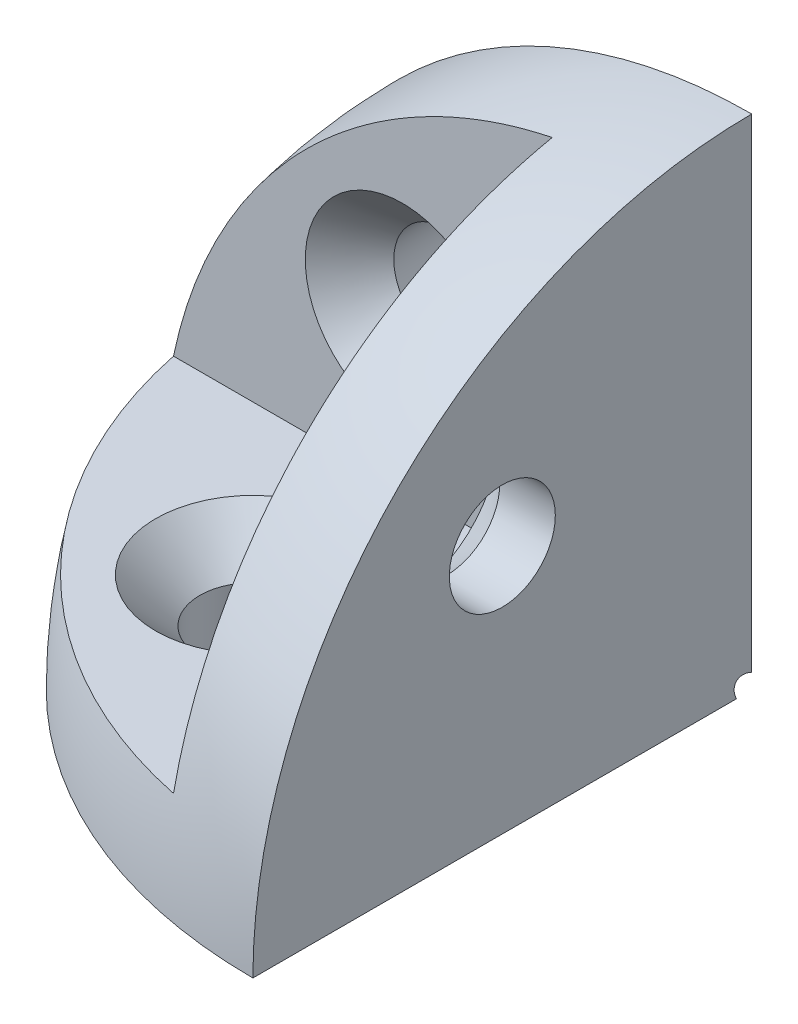
ISO-10303-21;
HEADER;
FILE_DESCRIPTION(('STEP AP214'),'2;1');
FILE_NAME('part.step','',(''),(''),'','','');
FILE_SCHEMA(('AUTOMOTIVE_DESIGN { 1 0 10303 214 1 1 1 1 }'));
ENDSEC;
DATA;
#1=APPLICATION_CONTEXT('core data for automotive mechanical design processes');
#2=APPLICATION_PROTOCOL_DEFINITION('international standard','automotive_design',2000,#1);
#3=PRODUCT_CONTEXT('',#1,'mechanical');
#4=PRODUCT('Part','Part','',(#3));
#5=PRODUCT_RELATED_PRODUCT_CATEGORY('part','',(#4));
#6=PRODUCT_DEFINITION_FORMATION('','',#4);
#7=PRODUCT_DEFINITION_CONTEXT('part definition',#1,'design');
#8=PRODUCT_DEFINITION('design','',#6,#7);
#9=PRODUCT_DEFINITION_SHAPE('','',#8);
#10=(LENGTH_UNIT() NAMED_UNIT(*) SI_UNIT(.MILLI.,.METRE.));
#11=(NAMED_UNIT(*) PLANE_ANGLE_UNIT() SI_UNIT($,.RADIAN.));
#12=(NAMED_UNIT(*) SI_UNIT($,.STERADIAN.) SOLID_ANGLE_UNIT());
#13=UNCERTAINTY_MEASURE_WITH_UNIT(LENGTH_MEASURE(1.E-05),#10,'distance_accuracy_value','');
#14=(GEOMETRIC_REPRESENTATION_CONTEXT(3) GLOBAL_UNCERTAINTY_ASSIGNED_CONTEXT((#13)) GLOBAL_UNIT_ASSIGNED_CONTEXT((#10,
#11,#12)) REPRESENTATION_CONTEXT('',''));
#15=CARTESIAN_POINT('',(0.,0.,0.));
#16=DIRECTION('',(0.,0.,1.));
#17=DIRECTION('',(1.,0.,0.));
#18=AXIS2_PLACEMENT_3D('',#15,#16,#17);
#19=CARTESIAN_POINT('',(0.,0.,0.));
#20=DIRECTION('',(0.,1.,0.));
#21=DIRECTION('',(0.,0.,1.));
#22=AXIS2_PLACEMENT_3D('',#19,#20,#21);
#23=PLANE('',#22);
#24=CARTESIAN_POINT('',(-19.9999999999999,0.,20.));
#25=DIRECTION('',(0.,-1.,0.));
#26=DIRECTION('',(0.,0.,-1.));
#27=AXIS2_PLACEMENT_3D('',#24,#25,#26);
#28=CIRCLE('',#27,4.25);
#29=CARTESIAN_POINT('',(-19.9999999999999,0.,15.75));
#30=VERTEX_POINT('',#29);
#31=EDGE_CURVE('E165',#30,#30,#28,.T.);
#32=ORIENTED_EDGE('',*,*,#31,.F.);
#33=EDGE_LOOP('',(#32));
#34=FACE_BOUND('',#33,.T.);
#35=DIRECTION('',(1.,0.,0.));
#36=VECTOR('',#35,1.);
#37=CARTESIAN_POINT('',(0.,0.,0.));
#38=LINE('',#37,#36);
#39=CARTESIAN_POINT('',(-40.,0.,0.));
#40=VERTEX_POINT('',#39);
#41=CARTESIAN_POINT('',(-1.22474487139158,0.,0.));
#42=VERTEX_POINT('',#41);
#43=EDGE_CURVE('E117',#40,#42,#38,.T.);
#44=ORIENTED_EDGE('',*,*,#43,.T.);
#45=CARTESIAN_POINT('',(0.,0.,0.));
#46=DIRECTION('',(0.,1.,0.));
#47=DIRECTION('',(0.707106781186546,0.,-0.707106781186549));
#48=AXIS2_PLACEMENT_3D('',#45,#46,#47);
#49=ELLIPSE('',#48,1.73205080756887,0.999999999999998);
#50=CARTESIAN_POINT('',(0.,0.,1.22474487139159));
#51=VERTEX_POINT('',#50);
#52=EDGE_CURVE('E48',#42,#51,#49,.T.);
#53=ORIENTED_EDGE('',*,*,#52,.T.);
#54=DIRECTION('',(0.,0.,-1.));
#55=VECTOR('',#54,1.);
#56=CARTESIAN_POINT('',(0.,0.,0.));
#57=LINE('',#56,#55);
#58=CARTESIAN_POINT('',(1.39659253553725E-13,0.,40.));
#59=VERTEX_POINT('',#58);
#60=EDGE_CURVE('E125',#59,#51,#57,.T.);
#61=ORIENTED_EDGE('',*,*,#60,.F.);
#62=CARTESIAN_POINT('',(0.,0.,0.));
#63=DIRECTION('',(0.,-1.,0.));
#64=DIRECTION('',(0.,0.,-1.));
#65=AXIS2_PLACEMENT_3D('',#62,#63,#64);
#66=CIRCLE('',#65,40.);
#67=EDGE_CURVE('E133',#59,#40,#66,.T.);
#68=ORIENTED_EDGE('',*,*,#67,.T.);
#69=EDGE_LOOP('',(#44,#53,#61,#68));
#70=FACE_BOUND('',#69,.T.);
#71=ADVANCED_FACE('F33',(#34,#70),#23,.F.);
#72=CARTESIAN_POINT('',(0.,0.,0.));
#73=DIRECTION('',(0.,-1.,0.));
#74=DIRECTION('',(0.,0.,1.));
#75=AXIS2_PLACEMENT_3D('',#72,#73,#74);
#76=SPHERICAL_SURFACE('',#75,40.);
#77=CARTESIAN_POINT('',(0.,0.,8.));
#78=DIRECTION('',(0.,0.,1.));
#79=DIRECTION('',(1.,0.,0.));
#80=AXIS2_PLACEMENT_3D('',#77,#78,#79);
#81=CIRCLE('',#80,39.1918358845309);
#82=CARTESIAN_POINT('',(-7.99999999999997,38.3666521865018,8.));
#83=VERTEX_POINT('',#82);
#84=CARTESIAN_POINT('',(-38.3666521865018,8.,8.));
#85=VERTEX_POINT('',#84);
#86=EDGE_CURVE('E102',#83,#85,#81,.T.);
#87=ORIENTED_EDGE('',*,*,#86,.F.);
#88=CARTESIAN_POINT('',(-8.,0.,0.));
#89=DIRECTION('',(1.,0.,0.));
#90=DIRECTION('',(0.,0.,-1.));
#91=AXIS2_PLACEMENT_3D('',#88,#89,#90);
#92=CIRCLE('',#91,39.1918358845309);
#93=CARTESIAN_POINT('',(-7.99999999999987,8.,38.3666521865018));
#94=VERTEX_POINT('',#93);
#95=EDGE_CURVE('E114',#83,#94,#92,.T.);
#96=ORIENTED_EDGE('',*,*,#95,.T.);
#97=CARTESIAN_POINT('',(0.,8.,0.));
#98=DIRECTION('',(0.,1.,0.));
#99=DIRECTION('',(0.,0.,1.));
#100=AXIS2_PLACEMENT_3D('',#97,#98,#99);
#101=CIRCLE('',#100,39.1918358845309);
#102=EDGE_CURVE('E115',#94,#85,#101,.F.);
#103=ORIENTED_EDGE('',*,*,#102,.T.);
#104=EDGE_LOOP('',(#87,#96,#103));
#105=FACE_BOUND('',#104,.T.);
#106=CARTESIAN_POINT('',(0.,0.,0.));
#107=DIRECTION('',(1.,0.,0.));
#108=DIRECTION('',(0.,0.,-1.));
#109=AXIS2_PLACEMENT_3D('',#106,#107,#108);
#110=CIRCLE('',#109,40.);
#111=CARTESIAN_POINT('',(0.,40.,0.));
#112=VERTEX_POINT('',#111);
#113=EDGE_CURVE('E130',#112,#59,#110,.T.);
#114=ORIENTED_EDGE('',*,*,#113,.F.);
#115=CARTESIAN_POINT('',(0.,0.,0.));
#116=DIRECTION('',(0.,0.,1.));
#117=DIRECTION('',(1.,0.,0.));
#118=AXIS2_PLACEMENT_3D('',#115,#116,#117);
#119=CIRCLE('',#118,40.);
#120=EDGE_CURVE('E122',#112,#40,#119,.T.);
#121=ORIENTED_EDGE('',*,*,#120,.T.);
#122=ORIENTED_EDGE('',*,*,#67,.F.);
#123=EDGE_LOOP('',(#114,#121,#122));
#124=FACE_BOUND('',#123,.T.);
#125=ADVANCED_FACE('F178',(#105,#124),#76,.T.);
#126=CARTESIAN_POINT('',(0.,0.,0.));
#127=DIRECTION('',(1.,0.,0.));
#128=DIRECTION('',(0.,0.,-1.));
#129=AXIS2_PLACEMENT_3D('',#126,#127,#128);
#130=PLANE('',#129);
#131=CARTESIAN_POINT('',(0.,0.,0.));
#132=DIRECTION('',(1.,0.,0.));
#133=DIRECTION('',(0.,-0.707106781186549,-0.707106781186546));
#134=AXIS2_PLACEMENT_3D('',#131,#132,#133);
#135=ELLIPSE('',#134,1.73205080756887,0.999999999999998);
#136=CARTESIAN_POINT('',(0.,1.22474487139159,0.));
#137=VERTEX_POINT('',#136);
#138=EDGE_CURVE('E169',#137,#51,#135,.T.);
#139=ORIENTED_EDGE('',*,*,#138,.F.);
#140=DIRECTION('',(0.,1.,0.));
#141=VECTOR('',#140,1.);
#142=CARTESIAN_POINT('',(0.,0.,0.));
#143=LINE('',#142,#141);
#144=EDGE_CURVE('E128',#137,#112,#143,.T.);
#145=ORIENTED_EDGE('',*,*,#144,.T.);
#146=ORIENTED_EDGE('',*,*,#113,.T.);
#147=ORIENTED_EDGE('',*,*,#60,.T.);
#148=EDGE_LOOP('',(#139,#145,#146,#147));
#149=FACE_BOUND('',#148,.T.);
#150=CARTESIAN_POINT('',(0.,20.,20.));
#151=DIRECTION('',(1.,0.,0.));
#152=DIRECTION('',(0.,0.,-1.));
#153=AXIS2_PLACEMENT_3D('',#150,#151,#152);
#154=CIRCLE('',#153,4.25);
#155=CARTESIAN_POINT('',(0.,20.,15.75));
#156=VERTEX_POINT('',#155);
#157=EDGE_CURVE('E103',#156,#156,#154,.T.);
#158=ORIENTED_EDGE('',*,*,#157,.F.);
#159=EDGE_LOOP('',(#158));
#160=FACE_BOUND('',#159,.T.);
#161=ADVANCED_FACE('F181',(#149,#160),#130,.T.);
#162=CARTESIAN_POINT('',(0.,0.,0.));
#163=DIRECTION('',(0.,0.,1.));
#164=DIRECTION('',(1.,0.,0.));
#165=AXIS2_PLACEMENT_3D('',#162,#163,#164);
#166=PLANE('',#165);
#167=CARTESIAN_POINT('',(-20.,20.,0.));
#168=DIRECTION('',(0.,0.,-1.));
#169=DIRECTION('',(-1.,0.,0.));
#170=AXIS2_PLACEMENT_3D('',#167,#168,#169);
#171=CIRCLE('',#170,4.25);
#172=CARTESIAN_POINT('',(-24.25,20.,0.));
#173=VERTEX_POINT('',#172);
#174=EDGE_CURVE('E107',#173,#173,#171,.T.);
#175=ORIENTED_EDGE('',*,*,#174,.F.);
#176=EDGE_LOOP('',(#175));
#177=FACE_BOUND('',#176,.T.);
#178=ORIENTED_EDGE('',*,*,#144,.F.);
#179=CARTESIAN_POINT('',(0.,0.,0.));
#180=DIRECTION('',(0.,0.,1.));
#181=DIRECTION('',(0.707106781186546,-0.707106781186549,0.));
#182=AXIS2_PLACEMENT_3D('',#179,#180,#181);
#183=ELLIPSE('',#182,1.73205080756887,0.999999999999998);
#184=EDGE_CURVE('E97',#137,#42,#183,.T.);
#185=ORIENTED_EDGE('',*,*,#184,.T.);
#186=ORIENTED_EDGE('',*,*,#43,.F.);
#187=ORIENTED_EDGE('',*,*,#120,.F.);
#188=EDGE_LOOP('',(#178,#185,#186,#187));
#189=FACE_BOUND('',#188,.T.);
#190=ADVANCED_FACE('F183',(#177,#189),#166,.F.);
#191=CARTESIAN_POINT('',(0.,8.,0.));
#192=DIRECTION('',(0.,1.,0.));
#193=DIRECTION('',(0.,0.,1.));
#194=AXIS2_PLACEMENT_3D('',#191,#192,#193);
#195=PLANE('',#194);
#196=CARTESIAN_POINT('',(-7.99999999999997,8.,8.));
#197=DIRECTION('',(0.,1.,0.));
#198=DIRECTION('',(0.707106781186546,0.,-0.707106781186549));
#199=AXIS2_PLACEMENT_3D('',#196,#197,#198);
#200=ELLIPSE('',#199,1.73205080756887,0.999999999999998);
#201=CARTESIAN_POINT('',(-9.22474487139156,8.,8.));
#202=VERTEX_POINT('',#201);
#203=CARTESIAN_POINT('',(-7.99999999999997,8.,9.22474487139159));
#204=VERTEX_POINT('',#203);
#205=EDGE_CURVE('E84',#202,#204,#200,.T.);
#206=ORIENTED_EDGE('',*,*,#205,.F.);
#207=DIRECTION('',(1.,0.,0.));
#208=VECTOR('',#207,1.);
#209=CARTESIAN_POINT('',(0.,8.,8.));
#210=LINE('',#209,#208);
#211=EDGE_CURVE('E93',#85,#202,#210,.T.);
#212=ORIENTED_EDGE('',*,*,#211,.F.);
#213=ORIENTED_EDGE('',*,*,#102,.F.);
#214=DIRECTION('',(0.,0.,-1.));
#215=VECTOR('',#214,1.);
#216=CARTESIAN_POINT('',(-8.,8.,0.));
#217=LINE('',#216,#215);
#218=EDGE_CURVE('E96',#94,#204,#217,.T.);
#219=ORIENTED_EDGE('',*,*,#218,.T.);
#220=EDGE_LOOP('',(#206,#212,#213,#219));
#221=FACE_BOUND('',#220,.T.);
#222=CARTESIAN_POINT('',(-19.9999999999999,8.,20.));
#223=DIRECTION('',(0.,1.,0.));
#224=DIRECTION('',(0.,0.,1.));
#225=AXIS2_PLACEMENT_3D('',#222,#223,#224);
#226=CIRCLE('',#225,7.80000000000001);
#227=CARTESIAN_POINT('',(-19.9999999999999,8.,27.8));
#228=VERTEX_POINT('',#227);
#229=EDGE_CURVE('E41',#228,#228,#226,.F.);
#230=ORIENTED_EDGE('',*,*,#229,.T.);
#231=EDGE_LOOP('',(#230));
#232=FACE_BOUND('',#231,.T.);
#233=ADVANCED_FACE('F91',(#221,#232),#195,.T.);
#234=CARTESIAN_POINT('',(-8.,0.,0.));
#235=DIRECTION('',(1.,0.,0.));
#236=DIRECTION('',(0.,0.,-1.));
#237=AXIS2_PLACEMENT_3D('',#234,#235,#236);
#238=PLANE('',#237);
#239=CARTESIAN_POINT('',(-7.99999999999993,20.,20.));
#240=DIRECTION('',(1.,0.,0.));
#241=DIRECTION('',(0.,0.,-1.));
#242=AXIS2_PLACEMENT_3D('',#239,#240,#241);
#243=CIRCLE('',#242,7.79999999999996);
#244=CARTESIAN_POINT('',(-7.99999999999996,20.,12.2000000000001));
#245=VERTEX_POINT('',#244);
#246=EDGE_CURVE('E135',#245,#245,#243,.T.);
#247=ORIENTED_EDGE('',*,*,#246,.T.);
#248=EDGE_LOOP('',(#247));
#249=FACE_BOUND('',#248,.T.);
#250=DIRECTION('',(0.,1.,0.));
#251=VECTOR('',#250,1.);
#252=CARTESIAN_POINT('',(-7.99999999999997,0.,8.));
#253=LINE('',#252,#251);
#254=CARTESIAN_POINT('',(-7.99999999999997,9.22474487139159,8.));
#255=VERTEX_POINT('',#254);
#256=EDGE_CURVE('E112',#255,#83,#253,.T.);
#257=ORIENTED_EDGE('',*,*,#256,.F.);
#258=CARTESIAN_POINT('',(-7.99999999999997,8.,8.));
#259=DIRECTION('',(1.,0.,0.));
#260=DIRECTION('',(0.,-0.707106781186549,-0.707106781186546));
#261=AXIS2_PLACEMENT_3D('',#258,#259,#260);
#262=ELLIPSE('',#261,1.73205080756887,0.999999999999998);
#263=EDGE_CURVE('E55',#255,#204,#262,.T.);
#264=ORIENTED_EDGE('',*,*,#263,.T.);
#265=ORIENTED_EDGE('',*,*,#218,.F.);
#266=ORIENTED_EDGE('',*,*,#95,.F.);
#267=EDGE_LOOP('',(#257,#264,#265,#266));
#268=FACE_BOUND('',#267,.T.);
#269=ADVANCED_FACE('F175',(#249,#268),#238,.F.);
#270=CARTESIAN_POINT('',(0.,0.,8.));
#271=DIRECTION('',(0.,0.,1.));
#272=DIRECTION('',(1.,0.,0.));
#273=AXIS2_PLACEMENT_3D('',#270,#271,#272);
#274=PLANE('',#273);
#275=CARTESIAN_POINT('',(-7.99999999999997,8.,8.));
#276=DIRECTION('',(0.,0.,1.));
#277=DIRECTION('',(0.707106781186546,-0.707106781186549,0.));
#278=AXIS2_PLACEMENT_3D('',#275,#276,#277);
#279=ELLIPSE('',#278,1.73205080756887,0.999999999999998);
#280=EDGE_CURVE('E11',#255,#202,#279,.T.);
#281=ORIENTED_EDGE('',*,*,#280,.F.);
#282=ORIENTED_EDGE('',*,*,#256,.T.);
#283=ORIENTED_EDGE('',*,*,#86,.T.);
#284=ORIENTED_EDGE('',*,*,#211,.T.);
#285=EDGE_LOOP('',(#281,#282,#283,#284));
#286=FACE_BOUND('',#285,.T.);
#287=CARTESIAN_POINT('',(-20.,20.,8.));
#288=DIRECTION('',(0.,0.,1.));
#289=DIRECTION('',(1.,0.,0.));
#290=AXIS2_PLACEMENT_3D('',#287,#288,#289);
#291=CIRCLE('',#290,7.80000000000001);
#292=CARTESIAN_POINT('',(-12.2,20.,8.));
#293=VERTEX_POINT('',#292);
#294=EDGE_CURVE('E144',#293,#293,#291,.F.);
#295=ORIENTED_EDGE('',*,*,#294,.T.);
#296=EDGE_LOOP('',(#295));
#297=FACE_BOUND('',#296,.T.);
#298=ADVANCED_FACE('F99',(#286,#297),#274,.T.);
#299=CARTESIAN_POINT('',(-40.0000000000001,20.,20.0000000000001));
#300=DIRECTION('',(1.,0.,0.));
#301=DIRECTION('',(0.,0.,-1.));
#302=AXIS2_PLACEMENT_3D('',#299,#300,#301);
#303=CYLINDRICAL_SURFACE('',#302,4.25);
#304=CARTESIAN_POINT('',(-4.44999999999997,20.,20.));
#305=DIRECTION('',(1.,0.,0.));
#306=DIRECTION('',(0.,0.,-1.));
#307=AXIS2_PLACEMENT_3D('',#304,#305,#306);
#308=CIRCLE('',#307,4.25);
#309=CARTESIAN_POINT('',(-4.44999999999998,20.,15.75));
#310=VERTEX_POINT('',#309);
#311=EDGE_CURVE('E138',#310,#310,#308,.F.);
#312=CARTESIAN_POINT('',(-4.44999999999998,20.,15.75));
#313=CARTESIAN_POINT('',(-4.40364583333331,20.,15.75));
#314=CARTESIAN_POINT('',(-4.35729166666665,20.,15.75));
#315=CARTESIAN_POINT('',(-4.26458333333331,20.,15.75));
#316=CARTESIAN_POINT('',(-4.21822916666664,20.,15.75));
#317=CARTESIAN_POINT('',(-4.12552083333331,20.,15.75));
#318=CARTESIAN_POINT('',(-4.07916666666664,20.,15.75));
#319=CARTESIAN_POINT('',(-3.98645833333331,20.,15.75));
#320=CARTESIAN_POINT('',(-3.94010416666664,20.,15.75));
#321=CARTESIAN_POINT('',(-3.84739583333331,20.,15.75));
#322=CARTESIAN_POINT('',(-3.80104166666664,20.,15.75));
#323=CARTESIAN_POINT('',(-3.70833333333331,20.,15.75));
#324=CARTESIAN_POINT('',(-3.66197916666664,20.,15.75));
#325=CARTESIAN_POINT('',(-3.56927083333331,20.,15.75));
#326=CARTESIAN_POINT('',(-3.52291666666664,20.,15.75));
#327=CARTESIAN_POINT('',(-3.43020833333331,20.,15.75));
#328=CARTESIAN_POINT('',(-3.38385416666664,20.,15.75));
#329=CARTESIAN_POINT('',(-3.29114583333331,20.,15.75));
#330=CARTESIAN_POINT('',(-3.24479166666664,20.,15.75));
#331=CARTESIAN_POINT('',(-3.1520833333333,20.,15.75));
#332=CARTESIAN_POINT('',(-3.10572916666664,20.,15.75));
#333=CARTESIAN_POINT('',(-3.0130208333333,20.,15.75));
#334=CARTESIAN_POINT('',(-2.96666666666663,20.,15.75));
#335=CARTESIAN_POINT('',(-2.8739583333333,20.,15.75));
#336=CARTESIAN_POINT('',(-2.82760416666664,20.,15.75));
#337=CARTESIAN_POINT('',(-2.7348958333333,20.,15.75));
#338=CARTESIAN_POINT('',(-2.68854166666664,20.,15.75));
#339=CARTESIAN_POINT('',(-2.5958333333333,20.,15.75));
#340=CARTESIAN_POINT('',(-2.54947916666663,20.,15.75));
#341=CARTESIAN_POINT('',(-2.4567708333333,20.,15.75));
#342=CARTESIAN_POINT('',(-2.41041666666663,20.,15.75));
#343=CARTESIAN_POINT('',(-2.3177083333333,20.,15.75));
#344=CARTESIAN_POINT('',(-2.27135416666663,20.,15.75));
#345=CARTESIAN_POINT('',(-2.1786458333333,20.,15.75));
#346=CARTESIAN_POINT('',(-2.13229166666663,20.,15.75));
#347=CARTESIAN_POINT('',(-2.03958333333329,20.,15.75));
#348=CARTESIAN_POINT('',(-1.99322916666663,20.,15.75));
#349=CARTESIAN_POINT('',(-1.90052083333329,20.,15.75));
#350=CARTESIAN_POINT('',(-1.85416666666662,20.,15.75));
#351=CARTESIAN_POINT('',(-1.76145833333329,20.,15.75));
#352=CARTESIAN_POINT('',(-1.71510416666662,20.,15.75));
#353=CARTESIAN_POINT('',(-1.62239583333329,20.,15.75));
#354=CARTESIAN_POINT('',(-1.57604166666663,20.,15.75));
#355=CARTESIAN_POINT('',(-1.48333333333329,20.,15.75));
#356=CARTESIAN_POINT('',(-1.43697916666663,20.,15.75));
#357=CARTESIAN_POINT('',(-1.34427083333329,20.,15.75));
#358=CARTESIAN_POINT('',(-1.29791666666662,20.,15.75));
#359=CARTESIAN_POINT('',(-1.20520833333329,20.,15.75));
#360=CARTESIAN_POINT('',(-1.15885416666662,20.,15.75));
#361=CARTESIAN_POINT('',(-1.06614583333329,20.,15.75));
#362=CARTESIAN_POINT('',(-1.01979166666662,20.,15.75));
#363=CARTESIAN_POINT('',(-0.927083333333284,20.,15.75));
#364=CARTESIAN_POINT('',(-0.880729166666617,20.,15.75));
#365=CARTESIAN_POINT('',(-0.788020833333282,20.,15.75));
#366=CARTESIAN_POINT('',(-0.741666666666615,20.,15.75));
#367=CARTESIAN_POINT('',(-0.648958333333283,20.,15.75));
#368=CARTESIAN_POINT('',(-0.602604166666618,20.,15.75));
#369=CARTESIAN_POINT('',(-0.509895833333285,20.,15.75));
#370=CARTESIAN_POINT('',(-0.463541666666618,20.,15.75));
#371=CARTESIAN_POINT('',(-0.370833333333283,20.,15.75));
#372=CARTESIAN_POINT('',(-0.324479166666616,20.,15.75));
#373=CARTESIAN_POINT('',(-0.231770833333281,20.,15.75));
#374=CARTESIAN_POINT('',(-0.185416666666614,20.,15.75));
#375=CARTESIAN_POINT('',(-0.0927083333332792,20.,15.75));
#376=CARTESIAN_POINT('',(-0.0463541666666118,20.,15.75));
#377=CARTESIAN_POINT('',(0.,20.,15.75));
#378=B_SPLINE_CURVE_WITH_KNOTS('',3,(#312,#313,#314,#315,#316,#317,#318,#319,#320,#321,#322,
#323,#324,#325,#326,#327,#328,#329,#330,#331,#332,#333,#334,#335,#336,#337,#338,#339,#340,#341,
#342,#343,#344,#345,#346,#347,#348,#349,#350,#351,#352,#353,#354,#355,#356,#357,#358,#359,#360,
#361,#362,#363,#364,#365,#366,#367,#368,#369,#370,#371,#372,#373,#374,#375,#376,#377),
.UNSPECIFIED.,.F.,.F.,(4,2,2,2,2,2,2,2,2,2,2,2,2,2,2,2,2,2,2,2,2,2,2,2,2,2,2,2,2,2,2,2,4),(0.,
0.139062500000002,0.278125000000004,0.417187500000006,0.556250000000008,0.695312500000003,
0.834375000000005,0.973437500000007,1.11250000000001,1.25156250000001,1.39062500000001,
1.52968750000002,1.66875000000001,1.80781250000001,1.94687500000001,2.08593750000002,
2.22500000000002,2.36406250000002,2.50312500000002,2.64218750000002,2.78125000000003,
2.92031250000002,3.05937500000002,3.19843750000003,3.33750000000003,3.47656250000003,
3.61562500000003,3.75468750000003,3.89375000000003,4.03281250000003,4.17187500000003,
4.31093750000004,4.45000000000004),.UNSPECIFIED.);
#379=EDGE_CURVE('BSEAM208',#310,#156,#378,.T.);
#380=ORIENTED_EDGE('',*,*,#311,.T.);
#381=ORIENTED_EDGE('',*,*,#157,.T.);
#382=ORIENTED_EDGE('',*,*,#379,.T.);
#383=ORIENTED_EDGE('',*,*,#379,.F.);
#384=EDGE_LOOP('',(#380,#382,#381,#383));
#385=FACE_BOUND('',#384,.T.);
#386=ADVANCED_FACE('F208',(#385),#303,.F.);
#387=CARTESIAN_POINT('',(-20.,20.,40.));
#388=DIRECTION('',(0.,0.,-1.));
#389=DIRECTION('',(-1.,0.,0.));
#390=AXIS2_PLACEMENT_3D('',#387,#388,#389);
#391=CYLINDRICAL_SURFACE('',#390,4.25);
#392=CARTESIAN_POINT('',(-20.,20.,4.45000000000001));
#393=DIRECTION('',(0.,0.,1.));
#394=DIRECTION('',(1.,0.,0.));
#395=AXIS2_PLACEMENT_3D('',#392,#393,#394);
#396=CIRCLE('',#395,4.25);
#397=CARTESIAN_POINT('',(-15.75,20.,4.45000000000001));
#398=VERTEX_POINT('',#397);
#399=EDGE_CURVE('E141',#398,#398,#396,.T.);
#400=ORIENTED_EDGE('',*,*,#399,.T.);
#401=EDGE_LOOP('',(#400));
#402=FACE_BOUND('',#401,.T.);
#403=ORIENTED_EDGE('',*,*,#174,.T.);
#404=EDGE_LOOP('',(#403));
#405=FACE_BOUND('',#404,.T.);
#406=ADVANCED_FACE('F161',(#402,#405),#391,.F.);
#407=CARTESIAN_POINT('',(-19.9999999999999,40.,20.));
#408=DIRECTION('',(0.,-1.,0.));
#409=DIRECTION('',(0.,0.,-1.));
#410=AXIS2_PLACEMENT_3D('',#407,#408,#409);
#411=CYLINDRICAL_SURFACE('',#410,4.25);
#412=CARTESIAN_POINT('',(-19.9999999999999,4.45000000000001,20.));
#413=DIRECTION('',(0.,1.,0.));
#414=DIRECTION('',(0.,0.,1.));
#415=AXIS2_PLACEMENT_3D('',#412,#413,#414);
#416=CIRCLE('',#415,4.25);
#417=CARTESIAN_POINT('',(-19.9999999999999,4.45000000000001,24.25));
#418=VERTEX_POINT('',#417);
#419=EDGE_CURVE('E147',#418,#418,#416,.T.);
#420=ORIENTED_EDGE('',*,*,#419,.T.);
#421=EDGE_LOOP('',(#420));
#422=FACE_BOUND('',#421,.T.);
#423=ORIENTED_EDGE('',*,*,#31,.T.);
#424=EDGE_LOOP('',(#423));
#425=FACE_BOUND('',#424,.T.);
#426=ADVANCED_FACE('F157',(#422,#425),#411,.F.);
#427=CARTESIAN_POINT('',(-7.99999999999993,20.,20.));
#428=DIRECTION('',(-1.,0.,0.));
#429=DIRECTION('',(0.,0.,1.));
#430=AXIS2_PLACEMENT_3D('',#427,#428,#429);
#431=CONICAL_SURFACE('',#430,7.79999999999997,0.785398163397448);
#432=ORIENTED_EDGE('',*,*,#311,.F.);
#433=EDGE_LOOP('',(#432));
#434=FACE_BOUND('',#433,.T.);
#435=ORIENTED_EDGE('',*,*,#246,.F.);
#436=EDGE_LOOP('',(#435));
#437=FACE_BOUND('',#436,.T.);
#438=ADVANCED_FACE('F160',(#434,#437),#431,.F.);
#439=CARTESIAN_POINT('',(-20.,20.,4.45000000000001));
#440=DIRECTION('',(0.,0.,1.));
#441=DIRECTION('',(1.,0.,0.));
#442=AXIS2_PLACEMENT_3D('',#439,#440,#441);
#443=CONICAL_SURFACE('',#442,4.25,0.78539816339745);
#444=CARTESIAN_POINT('',(-12.2,20.,8.));
#445=CARTESIAN_POINT('',(-12.2369791666667,20.,7.96302083333333));
#446=CARTESIAN_POINT('',(-12.2739583333333,20.,7.92604166666666));
#447=CARTESIAN_POINT('',(-12.3479166666667,20.,7.85208333333333));
#448=CARTESIAN_POINT('',(-12.3848958333333,20.,7.81510416666667));
#449=CARTESIAN_POINT('',(-12.4588541666667,20.,7.74114583333333));
#450=CARTESIAN_POINT('',(-12.4958333333333,20.,7.70416666666667));
#451=CARTESIAN_POINT('',(-12.5697916666667,20.,7.63020833333333));
#452=CARTESIAN_POINT('',(-12.6067708333333,20.,7.59322916666667));
#453=CARTESIAN_POINT('',(-12.6807291666667,20.,7.51927083333333));
#454=CARTESIAN_POINT('',(-12.7177083333333,20.,7.48229166666667));
#455=CARTESIAN_POINT('',(-12.7916666666667,20.,7.40833333333333));
#456=CARTESIAN_POINT('',(-12.8286458333333,20.,7.37135416666667));
#457=CARTESIAN_POINT('',(-12.9026041666667,20.,7.29739583333333));
#458=CARTESIAN_POINT('',(-12.9395833333333,20.,7.26041666666667));
#459=CARTESIAN_POINT('',(-13.0135416666667,20.,7.18645833333333));
#460=CARTESIAN_POINT('',(-13.0505208333333,20.,7.14947916666667));
#461=CARTESIAN_POINT('',(-13.1244791666667,20.,7.07552083333333));
#462=CARTESIAN_POINT('',(-13.1614583333333,20.,7.03854166666667));
#463=CARTESIAN_POINT('',(-13.2354166666667,20.,6.96458333333334));
#464=CARTESIAN_POINT('',(-13.2723958333333,20.,6.92760416666667));
#465=CARTESIAN_POINT('',(-13.3463541666667,20.,6.85364583333334));
#466=CARTESIAN_POINT('',(-13.3833333333333,20.,6.81666666666667));
#467=CARTESIAN_POINT('',(-13.4572916666667,20.,6.74270833333334));
#468=CARTESIAN_POINT('',(-13.4942708333333,20.,6.70572916666667));
#469=CARTESIAN_POINT('',(-13.5682291666667,20.,6.63177083333334));
#470=CARTESIAN_POINT('',(-13.6052083333333,20.,6.59479166666667));
#471=CARTESIAN_POINT('',(-13.6791666666667,20.,6.52083333333334));
#472=CARTESIAN_POINT('',(-13.7161458333333,20.,6.48385416666667));
#473=CARTESIAN_POINT('',(-13.7901041666667,20.,6.40989583333334));
#474=CARTESIAN_POINT('',(-13.8270833333333,20.,6.37291666666667));
#475=CARTESIAN_POINT('',(-13.9010416666667,20.,6.29895833333334));
#476=CARTESIAN_POINT('',(-13.9380208333333,20.,6.26197916666667));
#477=CARTESIAN_POINT('',(-14.0119791666667,20.,6.18802083333334));
#478=CARTESIAN_POINT('',(-14.0489583333333,20.,6.15104166666667));
#479=CARTESIAN_POINT('',(-14.1229166666667,20.,6.07708333333334));
#480=CARTESIAN_POINT('',(-14.1598958333333,20.,6.04010416666667));
#481=CARTESIAN_POINT('',(-14.2338541666667,20.,5.96614583333334));
#482=CARTESIAN_POINT('',(-14.2708333333333,20.,5.92916666666667));
#483=CARTESIAN_POINT('',(-14.3447916666667,20.,5.85520833333334));
#484=CARTESIAN_POINT('',(-14.3817708333333,20.,5.81822916666667));
#485=CARTESIAN_POINT('',(-14.4557291666667,20.,5.74427083333334));
#486=CARTESIAN_POINT('',(-14.4927083333333,20.,5.70729166666667));
#487=CARTESIAN_POINT('',(-14.5666666666667,20.,5.63333333333334));
#488=CARTESIAN_POINT('',(-14.6036458333333,20.,5.59635416666667));
#489=CARTESIAN_POINT('',(-14.6776041666667,20.,5.52239583333334));
#490=CARTESIAN_POINT('',(-14.7145833333333,20.,5.48541666666667));
#491=CARTESIAN_POINT('',(-14.7885416666667,20.,5.41145833333334));
#492=CARTESIAN_POINT('',(-14.8255208333333,20.,5.37447916666667));
#493=CARTESIAN_POINT('',(-14.8994791666667,20.,5.30052083333334));
#494=CARTESIAN_POINT('',(-14.9364583333333,20.,5.26354166666667));
#495=CARTESIAN_POINT('',(-15.0104166666667,20.,5.18958333333334));
#496=CARTESIAN_POINT('',(-15.0473958333333,20.,5.15260416666667));
#497=CARTESIAN_POINT('',(-15.1213541666667,20.,5.07864583333334));
#498=CARTESIAN_POINT('',(-15.1583333333333,20.,5.04166666666667));
#499=CARTESIAN_POINT('',(-15.2322916666667,20.,4.96770833333334));
#500=CARTESIAN_POINT('',(-15.2692708333333,20.,4.93072916666667));
#501=CARTESIAN_POINT('',(-15.3432291666667,20.,4.85677083333334));
#502=CARTESIAN_POINT('',(-15.3802083333333,20.,4.81979166666667));
#503=CARTESIAN_POINT('',(-15.4541666666667,20.,4.74583333333334));
#504=CARTESIAN_POINT('',(-15.4911458333333,20.,4.70885416666667));
#505=CARTESIAN_POINT('',(-15.5651041666667,20.,4.63489583333334));
#506=CARTESIAN_POINT('',(-15.6020833333333,20.,4.59791666666668));
#507=CARTESIAN_POINT('',(-15.6760416666667,20.,4.52395833333334));
#508=CARTESIAN_POINT('',(-15.7130208333333,20.,4.48697916666668));
#509=CARTESIAN_POINT('',(-15.75,20.,4.45000000000001));
#510=B_SPLINE_CURVE_WITH_KNOTS('',3,(#444,#445,#446,#447,#448,#449,#450,#451,#452,#453,#454,
#455,#456,#457,#458,#459,#460,#461,#462,#463,#464,#465,#466,#467,#468,#469,#470,#471,#472,#473,
#474,#475,#476,#477,#478,#479,#480,#481,#482,#483,#484,#485,#486,#487,#488,#489,#490,#491,#492,
#493,#494,#495,#496,#497,#498,#499,#500,#501,#502,#503,#504,#505,#506,#507,#508,#509),
.UNSPECIFIED.,.F.,.F.,(4,2,2,2,2,2,2,2,2,2,2,2,2,2,2,2,2,2,2,2,2,2,2,2,2,2,2,2,2,2,2,2,4),(0.,
0.156889317075765,0.31377863415153,0.470667951227295,0.62755726830306,0.784446585378826,
0.941335902454591,1.09822521953036,1.25511453660612,1.41200385368189,1.56889317075765,
1.72578248783341,1.88267180490918,2.03956112198495,2.19645043906071,2.35333975613647,
2.51022907321224,2.66711839028801,2.82400770736377,2.98089702443954,3.1377863415153,
3.29467565859107,3.45156497566683,3.6084542927426,3.76534360981836,3.92223292689413,
4.07912224396989,4.23601156104566,4.39290087812142,4.54979019519719,4.70667951227295,
4.86356882934872,5.02045814642448),.UNSPECIFIED.);
#511=EDGE_CURVE('BSEAM154',#293,#398,#510,.T.);
#512=ORIENTED_EDGE('',*,*,#294,.F.);
#513=ORIENTED_EDGE('',*,*,#399,.F.);
#514=ORIENTED_EDGE('',*,*,#511,.T.);
#515=ORIENTED_EDGE('',*,*,#511,.F.);
#516=EDGE_LOOP('',(#512,#514,#513,#515));
#517=FACE_BOUND('',#516,.T.);
#518=ADVANCED_FACE('F154',(#517),#443,.F.);
#519=CARTESIAN_POINT('',(-19.9999999999999,4.45000000000001,20.));
#520=DIRECTION('',(0.,1.,0.));
#521=DIRECTION('',(0.,0.,1.));
#522=AXIS2_PLACEMENT_3D('',#519,#520,#521);
#523=CONICAL_SURFACE('',#522,4.25,0.785398163397451);
#524=CARTESIAN_POINT('',(-19.9999999999999,8.,27.8));
#525=CARTESIAN_POINT('',(-19.9999999999999,7.96302083333334,27.7630208333333));
#526=CARTESIAN_POINT('',(-19.9999999999999,7.92604166666667,27.7260416666667));
#527=CARTESIAN_POINT('',(-19.9999999999999,7.85208333333334,27.6520833333333));
#528=CARTESIAN_POINT('',(-19.9999999999999,7.81510416666667,27.6151041666667));
#529=CARTESIAN_POINT('',(-19.9999999999999,7.74114583333334,27.5411458333333));
#530=CARTESIAN_POINT('',(-19.9999999999999,7.70416666666667,27.5041666666667));
#531=CARTESIAN_POINT('',(-19.9999999999999,7.63020833333334,27.4302083333333));
#532=CARTESIAN_POINT('',(-19.9999999999999,7.59322916666667,27.3932291666667));
#533=CARTESIAN_POINT('',(-19.9999999999999,7.51927083333334,27.3192708333333));
#534=CARTESIAN_POINT('',(-19.9999999999999,7.48229166666667,27.2822916666667));
#535=CARTESIAN_POINT('',(-19.9999999999999,7.40833333333333,27.2083333333333));
#536=CARTESIAN_POINT('',(-19.9999999999999,7.37135416666667,27.1713541666667));
#537=CARTESIAN_POINT('',(-19.9999999999999,7.29739583333334,27.0973958333333));
#538=CARTESIAN_POINT('',(-19.9999999999999,7.26041666666667,27.0604166666667));
#539=CARTESIAN_POINT('',(-19.9999999999999,7.18645833333334,26.9864583333333));
#540=CARTESIAN_POINT('',(-19.9999999999999,7.14947916666667,26.9494791666667));
#541=CARTESIAN_POINT('',(-19.9999999999999,7.07552083333334,26.8755208333333));
#542=CARTESIAN_POINT('',(-19.9999999999999,7.03854166666667,26.8385416666667));
#543=CARTESIAN_POINT('',(-19.9999999999999,6.96458333333334,26.7645833333333));
#544=CARTESIAN_POINT('',(-19.9999999999999,6.92760416666667,26.7276041666667));
#545=CARTESIAN_POINT('',(-19.9999999999999,6.85364583333334,26.6536458333333));
#546=CARTESIAN_POINT('',(-19.9999999999999,6.81666666666667,26.6166666666667));
#547=CARTESIAN_POINT('',(-19.9999999999999,6.74270833333334,26.5427083333333));
#548=CARTESIAN_POINT('',(-19.9999999999999,6.70572916666667,26.5057291666667));
#549=CARTESIAN_POINT('',(-19.9999999999999,6.63177083333334,26.4317708333333));
#550=CARTESIAN_POINT('',(-19.9999999999999,6.59479166666667,26.3947916666667));
#551=CARTESIAN_POINT('',(-19.9999999999999,6.52083333333334,26.3208333333333));
#552=CARTESIAN_POINT('',(-19.9999999999999,6.48385416666667,26.2838541666667));
#553=CARTESIAN_POINT('',(-19.9999999999999,6.40989583333334,26.2098958333333));
#554=CARTESIAN_POINT('',(-19.9999999999999,6.37291666666667,26.1729166666667));
#555=CARTESIAN_POINT('',(-19.9999999999999,6.29895833333334,26.0989583333333));
#556=CARTESIAN_POINT('',(-19.9999999999999,6.26197916666667,26.0619791666667));
#557=CARTESIAN_POINT('',(-19.9999999999999,6.18802083333334,25.9880208333333));
#558=CARTESIAN_POINT('',(-19.9999999999999,6.15104166666667,25.9510416666667));
#559=CARTESIAN_POINT('',(-19.9999999999999,6.07708333333334,25.8770833333333));
#560=CARTESIAN_POINT('',(-19.9999999999999,6.04010416666667,25.8401041666667));
#561=CARTESIAN_POINT('',(-19.9999999999999,5.96614583333334,25.7661458333333));
#562=CARTESIAN_POINT('',(-19.9999999999999,5.92916666666667,25.7291666666667));
#563=CARTESIAN_POINT('',(-19.9999999999999,5.85520833333334,25.6552083333333));
#564=CARTESIAN_POINT('',(-19.9999999999999,5.81822916666667,25.6182291666667));
#565=CARTESIAN_POINT('',(-19.9999999999999,5.74427083333334,25.5442708333333));
#566=CARTESIAN_POINT('',(-19.9999999999999,5.70729166666667,25.5072916666667));
#567=CARTESIAN_POINT('',(-19.9999999999999,5.63333333333334,25.4333333333333));
#568=CARTESIAN_POINT('',(-19.9999999999999,5.59635416666667,25.3963541666667));
#569=CARTESIAN_POINT('',(-19.9999999999999,5.52239583333334,25.3223958333333));
#570=CARTESIAN_POINT('',(-19.9999999999999,5.48541666666667,25.2854166666667));
#571=CARTESIAN_POINT('',(-19.9999999999999,5.41145833333334,25.2114583333333));
#572=CARTESIAN_POINT('',(-19.9999999999999,5.37447916666667,25.1744791666667));
#573=CARTESIAN_POINT('',(-19.9999999999999,5.30052083333334,25.1005208333333));
#574=CARTESIAN_POINT('',(-19.9999999999999,5.26354166666667,25.0635416666667));
#575=CARTESIAN_POINT('',(-19.9999999999999,5.18958333333334,24.9895833333333));
#576=CARTESIAN_POINT('',(-19.9999999999999,5.15260416666667,24.9526041666667));
#577=CARTESIAN_POINT('',(-19.9999999999999,5.07864583333334,24.8786458333333));
#578=CARTESIAN_POINT('',(-19.9999999999999,5.04166666666667,24.8416666666667));
#579=CARTESIAN_POINT('',(-19.9999999999999,4.96770833333334,24.7677083333333));
#580=CARTESIAN_POINT('',(-19.9999999999999,4.93072916666667,24.7307291666667));
#581=CARTESIAN_POINT('',(-19.9999999999999,4.85677083333334,24.6567708333333));
#582=CARTESIAN_POINT('',(-19.9999999999999,4.81979166666668,24.6197916666667));
#583=CARTESIAN_POINT('',(-19.9999999999999,4.74583333333334,24.5458333333333));
#584=CARTESIAN_POINT('',(-19.9999999999999,4.70885416666667,24.5088541666667));
#585=CARTESIAN_POINT('',(-19.9999999999999,4.63489583333334,24.4348958333333));
#586=CARTESIAN_POINT('',(-19.9999999999999,4.59791666666667,24.3979166666667));
#587=CARTESIAN_POINT('',(-19.9999999999999,4.52395833333334,24.3239583333333));
#588=CARTESIAN_POINT('',(-19.9999999999999,4.48697916666668,24.2869791666667));
#589=CARTESIAN_POINT('',(-19.9999999999999,4.45000000000001,24.25));
#590=B_SPLINE_CURVE_WITH_KNOTS('',3,(#524,#525,#526,#527,#528,#529,#530,#531,#532,#533,#534,
#535,#536,#537,#538,#539,#540,#541,#542,#543,#544,#545,#546,#547,#548,#549,#550,#551,#552,#553,
#554,#555,#556,#557,#558,#559,#560,#561,#562,#563,#564,#565,#566,#567,#568,#569,#570,#571,#572,
#573,#574,#575,#576,#577,#578,#579,#580,#581,#582,#583,#584,#585,#586,#587,#588,#589),
.UNSPECIFIED.,.F.,.F.,(4,2,2,2,2,2,2,2,2,2,2,2,2,2,2,2,2,2,2,2,2,2,2,2,2,2,2,2,2,2,2,2,4),(0.,
0.156889317075766,0.31377863415153,0.470667951227297,0.627557268303063,0.784446585378827,
0.941335902454593,1.09822521953036,1.25511453660612,1.41200385368189,1.56889317075765,
1.72578248783342,1.88267180490919,2.03956112198495,2.19645043906072,2.35333975613648,
2.51022907321225,2.66711839028801,2.82400770736378,2.98089702443954,3.13778634151531,
3.29467565859107,3.45156497566684,3.6084542927426,3.76534360981837,3.92223292689413,
4.0791222439699,4.23601156104566,4.39290087812143,4.5497901951972,4.70667951227296,
4.86356882934873,5.02045814642449),.UNSPECIFIED.);
#591=EDGE_CURVE('BSEAM35',#228,#418,#590,.T.);
#592=ORIENTED_EDGE('',*,*,#229,.F.);
#593=ORIENTED_EDGE('',*,*,#419,.F.);
#594=ORIENTED_EDGE('',*,*,#591,.T.);
#595=ORIENTED_EDGE('',*,*,#591,.F.);
#596=EDGE_LOOP('',(#592,#594,#593,#595));
#597=FACE_BOUND('',#596,.T.);
#598=ADVANCED_FACE('F35',(#597),#523,.F.);
#599=CARTESIAN_POINT('',(3.71868125263226,-3.71868125263227,-3.71868125263227));
#600=DIRECTION('',(0.577350269189624,-0.577350269189627,-0.577350269189626));
#601=DIRECTION('',(0.,0.707106781186547,-0.707106781186548));
#602=AXIS2_PLACEMENT_3D('',#599,#600,#601);
#603=CYLINDRICAL_SURFACE('',#602,0.999999999999998);
#604=ORIENTED_EDGE('',*,*,#205,.T.);
#605=ORIENTED_EDGE('',*,*,#263,.F.);
#606=ORIENTED_EDGE('',*,*,#280,.T.);
#607=EDGE_LOOP('',(#604,#605,#606));
#608=FACE_BOUND('',#607,.T.);
#609=ORIENTED_EDGE('',*,*,#184,.F.);
#610=ORIENTED_EDGE('',*,*,#138,.T.);
#611=ORIENTED_EDGE('',*,*,#52,.F.);
#612=EDGE_LOOP('',(#609,#610,#611));
#613=FACE_BOUND('',#612,.T.);
#614=ADVANCED_FACE('F83',(#608,#613),#603,.F.);
#615=CLOSED_SHELL('',(#71,#125,#161,#190,#233,#269,#298,#386,#406,#426,#438,#518,#598,#614));
#616=MANIFOLD_SOLID_BREP('B2',#615);
#617=ADVANCED_BREP_SHAPE_REPRESENTATION('',(#18,#616),#14);
#618=SHAPE_DEFINITION_REPRESENTATION(#9,#617);
ENDSEC;
END-ISO-10303-21;
